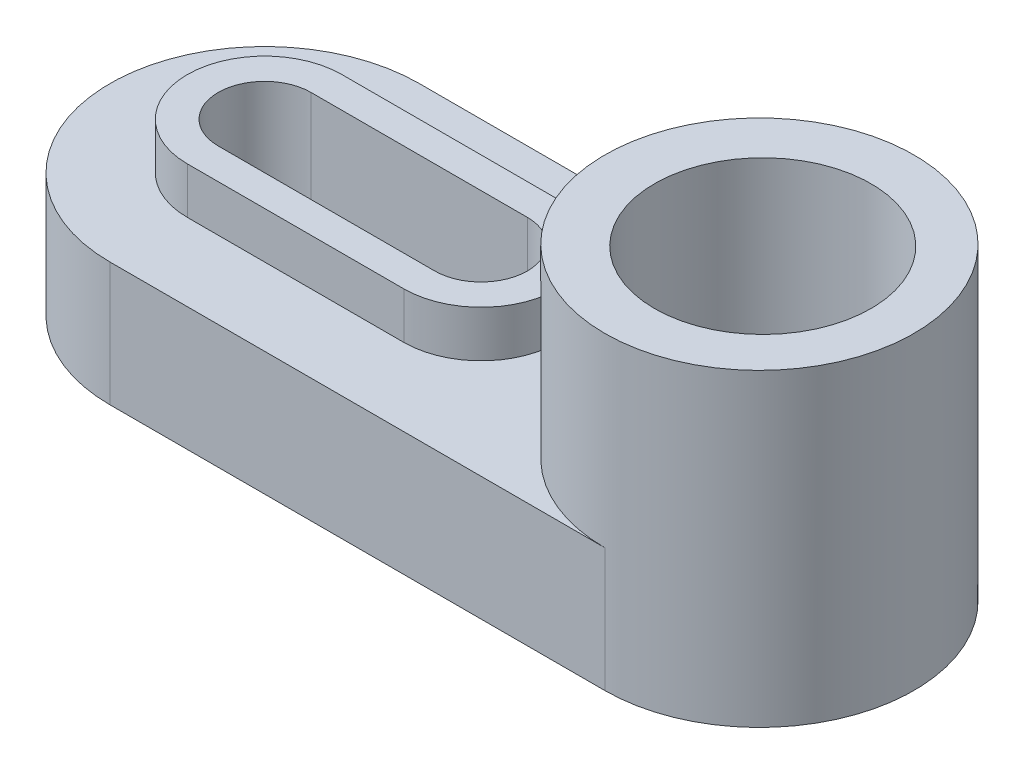
ISO-10303-21;
HEADER;
FILE_DESCRIPTION(('STEP AP214'),'2;1');
FILE_NAME('part.step','',(''),(''),'','','');
FILE_SCHEMA(('AUTOMOTIVE_DESIGN { 1 0 10303 214 1 1 1 1 }'));
ENDSEC;
DATA;
#1=APPLICATION_CONTEXT('core data for automotive mechanical design processes');
#2=APPLICATION_PROTOCOL_DEFINITION('international standard','automotive_design',2000,#1);
#3=PRODUCT_CONTEXT('',#1,'mechanical');
#4=PRODUCT('Part','Part','',(#3));
#5=PRODUCT_RELATED_PRODUCT_CATEGORY('part','',(#4));
#6=PRODUCT_DEFINITION_FORMATION('','',#4);
#7=PRODUCT_DEFINITION_CONTEXT('part definition',#1,'design');
#8=PRODUCT_DEFINITION('design','',#6,#7);
#9=PRODUCT_DEFINITION_SHAPE('','',#8);
#10=(LENGTH_UNIT() NAMED_UNIT(*) SI_UNIT(.MILLI.,.METRE.));
#11=(NAMED_UNIT(*) PLANE_ANGLE_UNIT() SI_UNIT($,.RADIAN.));
#12=(NAMED_UNIT(*) SI_UNIT($,.STERADIAN.) SOLID_ANGLE_UNIT());
#13=UNCERTAINTY_MEASURE_WITH_UNIT(LENGTH_MEASURE(1.E-05),#10,'distance_accuracy_value','');
#14=(GEOMETRIC_REPRESENTATION_CONTEXT(3) GLOBAL_UNCERTAINTY_ASSIGNED_CONTEXT((#13)) GLOBAL_UNIT_ASSIGNED_CONTEXT((#10,
#11,#12)) REPRESENTATION_CONTEXT('',''));
#15=CARTESIAN_POINT('',(0.,0.,0.));
#16=DIRECTION('',(0.,0.,1.));
#17=DIRECTION('',(1.,0.,0.));
#18=AXIS2_PLACEMENT_3D('',#15,#16,#17);
#19=CARTESIAN_POINT('',(0.,8.,0.));
#20=DIRECTION('',(0.,1.,0.));
#21=DIRECTION('',(0.,0.,1.));
#22=AXIS2_PLACEMENT_3D('',#19,#20,#21);
#23=PLANE('',#22);
#24=DIRECTION('',(1.,0.,0.));
#25=VECTOR('',#24,1.);
#26=CARTESIAN_POINT('',(0.,8.,10.));
#27=LINE('',#26,#25);
#28=CARTESIAN_POINT('',(-16.,8.,10.));
#29=VERTEX_POINT('',#28);
#30=CARTESIAN_POINT('',(16.,8.,10.));
#31=VERTEX_POINT('',#30);
#32=EDGE_CURVE('E190',#29,#31,#27,.T.);
#33=ORIENTED_EDGE('',*,*,#32,.T.);
#34=CARTESIAN_POINT('',(16.,8.,0.));
#35=DIRECTION('',(0.,1.,0.));
#36=DIRECTION('',(0.,0.,1.));
#37=AXIS2_PLACEMENT_3D('',#34,#35,#36);
#38=CIRCLE('',#37,10.);
#39=CARTESIAN_POINT('',(16.,8.,-10.));
#40=VERTEX_POINT('',#39);
#41=EDGE_CURVE('E193',#40,#31,#38,.T.);
#42=ORIENTED_EDGE('',*,*,#41,.F.);
#43=DIRECTION('',(1.,0.,0.));
#44=VECTOR('',#43,1.);
#45=CARTESIAN_POINT('',(0.,8.,-10.));
#46=LINE('',#45,#44);
#47=CARTESIAN_POINT('',(-16.,8.,-10.));
#48=VERTEX_POINT('',#47);
#49=EDGE_CURVE('E196',#48,#40,#46,.T.);
#50=ORIENTED_EDGE('',*,*,#49,.F.);
#51=CARTESIAN_POINT('',(-16.,8.,0.));
#52=DIRECTION('',(0.,1.,0.));
#53=DIRECTION('',(0.,0.,1.));
#54=AXIS2_PLACEMENT_3D('',#51,#52,#53);
#55=CIRCLE('',#54,10.);
#56=EDGE_CURVE('E199',#48,#29,#55,.T.);
#57=ORIENTED_EDGE('',*,*,#56,.T.);
#58=EDGE_LOOP('',(#33,#42,#50,#57));
#59=FACE_BOUND('',#58,.T.);
#60=DIRECTION('',(-1.,0.,0.));
#61=VECTOR('',#60,1.);
#62=CARTESIAN_POINT('',(0.,8.,5.));
#63=LINE('',#62,#61);
#64=CARTESIAN_POINT('',(-2.,8.,5.));
#65=VERTEX_POINT('',#64);
#66=CARTESIAN_POINT('',(-16.,8.,5.));
#67=VERTEX_POINT('',#66);
#68=EDGE_CURVE('E53',#65,#67,#63,.T.);
#69=ORIENTED_EDGE('',*,*,#68,.T.);
#70=CARTESIAN_POINT('',(-16.,8.,0.));
#71=DIRECTION('',(0.,1.,0.));
#72=DIRECTION('',(0.,0.,1.));
#73=AXIS2_PLACEMENT_3D('',#70,#71,#72);
#74=CIRCLE('',#73,5.);
#75=CARTESIAN_POINT('',(-16.,8.,-5.));
#76=VERTEX_POINT('',#75);
#77=EDGE_CURVE('E11',#67,#76,#74,.F.);
#78=ORIENTED_EDGE('',*,*,#77,.T.);
#79=DIRECTION('',(1.,0.,0.));
#80=VECTOR('',#79,1.);
#81=CARTESIAN_POINT('',(0.,8.,-5.));
#82=LINE('',#81,#80);
#83=CARTESIAN_POINT('',(-2.,8.,-5.));
#84=VERTEX_POINT('',#83);
#85=EDGE_CURVE('E222',#76,#84,#82,.T.);
#86=ORIENTED_EDGE('',*,*,#85,.T.);
#87=CARTESIAN_POINT('',(-2.,8.,0.));
#88=DIRECTION('',(0.,1.,0.));
#89=DIRECTION('',(0.,0.,1.));
#90=AXIS2_PLACEMENT_3D('',#87,#88,#89);
#91=CIRCLE('',#90,5.);
#92=EDGE_CURVE('E226',#84,#65,#91,.F.);
#93=ORIENTED_EDGE('',*,*,#92,.T.);
#94=EDGE_LOOP('',(#69,#78,#86,#93));
#95=FACE_BOUND('',#94,.T.);
#96=ADVANCED_FACE('F43',(#59,#95),#23,.T.);
#97=CARTESIAN_POINT('',(16.,20.,0.));
#98=DIRECTION('',(0.,-1.,0.));
#99=DIRECTION('',(0.,0.,-1.));
#100=AXIS2_PLACEMENT_3D('',#97,#98,#99);
#101=CYLINDRICAL_SURFACE('',#100,10.);
#102=ORIENTED_EDGE('',*,*,#41,.T.);
#103=DIRECTION('',(0.,-1.,0.));
#104=VECTOR('',#103,1.);
#105=CARTESIAN_POINT('',(16.,8.,9.99999999999999));
#106=LINE('',#105,#104);
#107=CARTESIAN_POINT('',(16.,0.,9.99999999999999));
#108=VERTEX_POINT('',#107);
#109=EDGE_CURVE('E215',#31,#108,#106,.T.);
#110=ORIENTED_EDGE('',*,*,#109,.T.);
#111=CARTESIAN_POINT('',(16.,0.,0.));
#112=DIRECTION('',(0.,1.,0.));
#113=DIRECTION('',(0.,0.,1.));
#114=AXIS2_PLACEMENT_3D('',#111,#112,#113);
#115=CIRCLE('',#114,10.);
#116=CARTESIAN_POINT('',(16.,0.,-10.));
#117=VERTEX_POINT('',#116);
#118=EDGE_CURVE('E218',#108,#117,#115,.T.);
#119=ORIENTED_EDGE('',*,*,#118,.T.);
#120=DIRECTION('',(0.,-1.,0.));
#121=VECTOR('',#120,1.);
#122=CARTESIAN_POINT('',(16.,8.,-10.));
#123=LINE('',#122,#121);
#124=EDGE_CURVE('E212',#40,#117,#123,.T.);
#125=ORIENTED_EDGE('',*,*,#124,.F.);
#126=EDGE_LOOP('',(#102,#110,#119,#125));
#127=FACE_BOUND('',#126,.T.);
#128=CARTESIAN_POINT('',(16.,20.,0.));
#129=DIRECTION('',(0.,1.,0.));
#130=DIRECTION('',(0.,0.,1.));
#131=AXIS2_PLACEMENT_3D('',#128,#129,#130);
#132=CIRCLE('',#131,10.);
#133=CARTESIAN_POINT('',(16.,20.,9.99999999999999));
#134=VERTEX_POINT('',#133);
#135=EDGE_CURVE('E219',#134,#134,#132,.T.);
#136=ORIENTED_EDGE('',*,*,#135,.F.);
#137=EDGE_LOOP('',(#136));
#138=FACE_BOUND('',#137,.T.);
#139=ADVANCED_FACE('F45',(#127,#138),#101,.T.);
#140=CARTESIAN_POINT('',(0.,20.,0.));
#141=DIRECTION('',(0.,1.,0.));
#142=DIRECTION('',(0.,0.,1.));
#143=AXIS2_PLACEMENT_3D('',#140,#141,#142);
#144=PLANE('',#143);
#145=CARTESIAN_POINT('',(16.2184239978713,20.,0.));
#146=DIRECTION('',(0.,1.,0.));
#147=DIRECTION('',(0.,0.,1.));
#148=AXIS2_PLACEMENT_3D('',#145,#146,#147);
#149=CIRCLE('',#148,7.);
#150=CARTESIAN_POINT('',(16.2184239978713,20.,7.));
#151=VERTEX_POINT('',#150);
#152=EDGE_CURVE('E285',#151,#151,#149,.T.);
#153=ORIENTED_EDGE('',*,*,#152,.F.);
#154=EDGE_LOOP('',(#153));
#155=FACE_BOUND('',#154,.T.);
#156=ORIENTED_EDGE('',*,*,#135,.T.);
#157=EDGE_LOOP('',(#156));
#158=FACE_BOUND('',#157,.T.);
#159=ADVANCED_FACE('F256',(#155,#158),#144,.T.);
#160=CARTESIAN_POINT('',(0.,0.,0.));
#161=DIRECTION('',(0.,1.,0.));
#162=DIRECTION('',(0.,0.,1.));
#163=AXIS2_PLACEMENT_3D('',#160,#161,#162);
#164=PLANE('',#163);
#165=CARTESIAN_POINT('',(16.2184239978713,0.,0.));
#166=DIRECTION('',(0.,1.,0.));
#167=DIRECTION('',(0.,0.,1.));
#168=AXIS2_PLACEMENT_3D('',#165,#166,#167);
#169=CIRCLE('',#168,7.);
#170=CARTESIAN_POINT('',(16.2184239978713,0.,7.));
#171=VERTEX_POINT('',#170);
#172=EDGE_CURVE('E159',#171,#171,#169,.T.);
#173=ORIENTED_EDGE('',*,*,#172,.T.);
#174=EDGE_LOOP('',(#173));
#175=FACE_BOUND('',#174,.T.);
#176=DIRECTION('',(1.,0.,0.));
#177=VECTOR('',#176,1.);
#178=CARTESIAN_POINT('',(0.,0.,3.));
#179=LINE('',#178,#177);
#180=CARTESIAN_POINT('',(-16.,0.,3.));
#181=VERTEX_POINT('',#180);
#182=CARTESIAN_POINT('',(-2.,0.,3.));
#183=VERTEX_POINT('',#182);
#184=EDGE_CURVE('E47',#181,#183,#179,.T.);
#185=ORIENTED_EDGE('',*,*,#184,.T.);
#186=CARTESIAN_POINT('',(-2.,0.,0.));
#187=DIRECTION('',(0.,-1.,0.));
#188=DIRECTION('',(0.,0.,-1.));
#189=AXIS2_PLACEMENT_3D('',#186,#187,#188);
#190=CIRCLE('',#189,3.);
#191=CARTESIAN_POINT('',(-2.,0.,-3.));
#192=VERTEX_POINT('',#191);
#193=EDGE_CURVE('E146',#183,#192,#190,.F.);
#194=ORIENTED_EDGE('',*,*,#193,.T.);
#195=DIRECTION('',(-1.,0.,0.));
#196=VECTOR('',#195,1.);
#197=CARTESIAN_POINT('',(0.,0.,-3.));
#198=LINE('',#197,#196);
#199=CARTESIAN_POINT('',(-16.,0.,-3.));
#200=VERTEX_POINT('',#199);
#201=EDGE_CURVE('E151',#200,#192,#198,.F.);
#202=ORIENTED_EDGE('',*,*,#201,.F.);
#203=CARTESIAN_POINT('',(-16.,0.,0.));
#204=DIRECTION('',(0.,-1.,0.));
#205=DIRECTION('',(0.,0.,-1.));
#206=AXIS2_PLACEMENT_3D('',#203,#204,#205);
#207=CIRCLE('',#206,3.);
#208=EDGE_CURVE('E154',#200,#181,#207,.F.);
#209=ORIENTED_EDGE('',*,*,#208,.T.);
#210=EDGE_LOOP('',(#185,#194,#202,#209));
#211=FACE_BOUND('',#210,.T.);
#212=ORIENTED_EDGE('',*,*,#118,.F.);
#213=DIRECTION('',(1.,0.,0.));
#214=VECTOR('',#213,1.);
#215=CARTESIAN_POINT('',(0.,0.,10.));
#216=LINE('',#215,#214);
#217=CARTESIAN_POINT('',(-16.,0.,10.));
#218=VERTEX_POINT('',#217);
#219=EDGE_CURVE('E189',#218,#108,#216,.T.);
#220=ORIENTED_EDGE('',*,*,#219,.F.);
#221=CARTESIAN_POINT('',(-16.,0.,0.));
#222=DIRECTION('',(0.,1.,0.));
#223=DIRECTION('',(0.,0.,1.));
#224=AXIS2_PLACEMENT_3D('',#221,#222,#223);
#225=CIRCLE('',#224,10.);
#226=CARTESIAN_POINT('',(-16.,0.,-10.));
#227=VERTEX_POINT('',#226);
#228=EDGE_CURVE('E194',#227,#218,#225,.T.);
#229=ORIENTED_EDGE('',*,*,#228,.F.);
#230=DIRECTION('',(1.,0.,0.));
#231=VECTOR('',#230,1.);
#232=CARTESIAN_POINT('',(0.,0.,-10.));
#233=LINE('',#232,#231);
#234=EDGE_CURVE('E204',#227,#117,#233,.T.);
#235=ORIENTED_EDGE('',*,*,#234,.T.);
#236=EDGE_LOOP('',(#212,#220,#229,#235));
#237=FACE_BOUND('',#236,.T.);
#238=ADVANCED_FACE('F152',(#175,#211,#237),#164,.F.);
#239=CARTESIAN_POINT('',(0.,8.,10.));
#240=DIRECTION('',(0.,0.,-1.));
#241=DIRECTION('',(-1.,0.,0.));
#242=AXIS2_PLACEMENT_3D('',#239,#240,#241);
#243=PLANE('',#242);
#244=ORIENTED_EDGE('',*,*,#219,.T.);
#245=ORIENTED_EDGE('',*,*,#109,.F.);
#246=ORIENTED_EDGE('',*,*,#32,.F.);
#247=DIRECTION('',(0.,-1.,0.));
#248=VECTOR('',#247,1.);
#249=CARTESIAN_POINT('',(-16.,8.,10.));
#250=LINE('',#249,#248);
#251=EDGE_CURVE('E201',#29,#218,#250,.T.);
#252=ORIENTED_EDGE('',*,*,#251,.T.);
#253=EDGE_LOOP('',(#244,#245,#246,#252));
#254=FACE_BOUND('',#253,.T.);
#255=ADVANCED_FACE('F270',(#254),#243,.F.);
#256=CARTESIAN_POINT('',(0.,8.,-10.));
#257=DIRECTION('',(0.,0.,-1.));
#258=DIRECTION('',(-1.,0.,0.));
#259=AXIS2_PLACEMENT_3D('',#256,#257,#258);
#260=PLANE('',#259);
#261=ORIENTED_EDGE('',*,*,#234,.F.);
#262=DIRECTION('',(0.,-1.,0.));
#263=VECTOR('',#262,1.);
#264=CARTESIAN_POINT('',(-16.,8.,-10.));
#265=LINE('',#264,#263);
#266=EDGE_CURVE('E210',#48,#227,#265,.T.);
#267=ORIENTED_EDGE('',*,*,#266,.F.);
#268=ORIENTED_EDGE('',*,*,#49,.T.);
#269=ORIENTED_EDGE('',*,*,#124,.T.);
#270=EDGE_LOOP('',(#261,#267,#268,#269));
#271=FACE_BOUND('',#270,.T.);
#272=ADVANCED_FACE('F266',(#271),#260,.T.);
#273=CARTESIAN_POINT('',(-16.,8.,0.));
#274=DIRECTION('',(0.,-1.,0.));
#275=DIRECTION('',(0.,0.,-1.));
#276=AXIS2_PLACEMENT_3D('',#273,#274,#275);
#277=CYLINDRICAL_SURFACE('',#276,10.);
#278=ORIENTED_EDGE('',*,*,#228,.T.);
#279=ORIENTED_EDGE('',*,*,#251,.F.);
#280=ORIENTED_EDGE('',*,*,#56,.F.);
#281=ORIENTED_EDGE('',*,*,#266,.T.);
#282=EDGE_LOOP('',(#278,#279,#280,#281));
#283=FACE_BOUND('',#282,.T.);
#284=ADVANCED_FACE('F263',(#283),#277,.T.);
#285=CARTESIAN_POINT('',(-16.,11.,0.));
#286=DIRECTION('',(0.,1.,0.));
#287=DIRECTION('',(0.,0.,1.));
#288=AXIS2_PLACEMENT_3D('',#285,#286,#287);
#289=PLANE('',#288);
#290=CARTESIAN_POINT('',(-16.,11.,0.));
#291=DIRECTION('',(0.,1.,0.));
#292=DIRECTION('',(0.,0.,1.));
#293=AXIS2_PLACEMENT_3D('',#290,#291,#292);
#294=CIRCLE('',#293,5.);
#295=CARTESIAN_POINT('',(-16.,11.,-5.));
#296=VERTEX_POINT('',#295);
#297=CARTESIAN_POINT('',(-16.,11.,5.));
#298=VERTEX_POINT('',#297);
#299=EDGE_CURVE('E169',#296,#298,#294,.T.);
#300=ORIENTED_EDGE('',*,*,#299,.T.);
#301=DIRECTION('',(1.,0.,0.));
#302=VECTOR('',#301,1.);
#303=CARTESIAN_POINT('',(-16.,11.,5.));
#304=LINE('',#303,#302);
#305=CARTESIAN_POINT('',(-2.,11.,5.));
#306=VERTEX_POINT('',#305);
#307=EDGE_CURVE('E172',#298,#306,#304,.T.);
#308=ORIENTED_EDGE('',*,*,#307,.T.);
#309=CARTESIAN_POINT('',(-2.,11.,0.));
#310=DIRECTION('',(0.,1.,0.));
#311=DIRECTION('',(0.,0.,1.));
#312=AXIS2_PLACEMENT_3D('',#309,#310,#311);
#313=CIRCLE('',#312,5.);
#314=CARTESIAN_POINT('',(-2.,11.,-5.));
#315=VERTEX_POINT('',#314);
#316=EDGE_CURVE('E174',#306,#315,#313,.T.);
#317=ORIENTED_EDGE('',*,*,#316,.T.);
#318=DIRECTION('',(-1.,0.,0.));
#319=VECTOR('',#318,1.);
#320=CARTESIAN_POINT('',(-16.,11.,-5.));
#321=LINE('',#320,#319);
#322=EDGE_CURVE('E176',#315,#296,#321,.T.);
#323=ORIENTED_EDGE('',*,*,#322,.T.);
#324=EDGE_LOOP('',(#300,#308,#317,#323));
#325=FACE_BOUND('',#324,.T.);
#326=DIRECTION('',(1.,0.,0.));
#327=VECTOR('',#326,1.);
#328=CARTESIAN_POINT('',(-16.,11.,3.));
#329=LINE('',#328,#327);
#330=CARTESIAN_POINT('',(-16.,11.,3.));
#331=VERTEX_POINT('',#330);
#332=CARTESIAN_POINT('',(-2.,11.,3.));
#333=VERTEX_POINT('',#332);
#334=EDGE_CURVE('E139',#331,#333,#329,.T.);
#335=ORIENTED_EDGE('',*,*,#334,.F.);
#336=CARTESIAN_POINT('',(-16.,11.,0.));
#337=DIRECTION('',(0.,1.,0.));
#338=DIRECTION('',(0.,0.,1.));
#339=AXIS2_PLACEMENT_3D('',#336,#337,#338);
#340=CIRCLE('',#339,3.);
#341=CARTESIAN_POINT('',(-16.,11.,-3.));
#342=VERTEX_POINT('',#341);
#343=EDGE_CURVE('E129',#342,#331,#340,.T.);
#344=ORIENTED_EDGE('',*,*,#343,.F.);
#345=DIRECTION('',(-1.,0.,0.));
#346=VECTOR('',#345,1.);
#347=CARTESIAN_POINT('',(-16.,11.,-3.));
#348=LINE('',#347,#346);
#349=CARTESIAN_POINT('',(-2.,11.,-3.));
#350=VERTEX_POINT('',#349);
#351=EDGE_CURVE('E163',#350,#342,#348,.T.);
#352=ORIENTED_EDGE('',*,*,#351,.F.);
#353=CARTESIAN_POINT('',(-2.,11.,0.));
#354=DIRECTION('',(0.,1.,0.));
#355=DIRECTION('',(0.,0.,1.));
#356=AXIS2_PLACEMENT_3D('',#353,#354,#355);
#357=CIRCLE('',#356,3.);
#358=EDGE_CURVE('E156',#333,#350,#357,.T.);
#359=ORIENTED_EDGE('',*,*,#358,.F.);
#360=EDGE_LOOP('',(#335,#344,#352,#359));
#361=FACE_BOUND('',#360,.T.);
#362=ADVANCED_FACE('F265',(#325,#361),#289,.T.);
#363=CARTESIAN_POINT('',(-16.,11.,0.));
#364=DIRECTION('',(0.,-1.,0.));
#365=DIRECTION('',(0.,0.,-1.));
#366=AXIS2_PLACEMENT_3D('',#363,#364,#365);
#367=CYLINDRICAL_SURFACE('',#366,5.);
#368=ORIENTED_EDGE('',*,*,#77,.F.);
#369=DIRECTION('',(0.,-1.,0.));
#370=VECTOR('',#369,1.);
#371=CARTESIAN_POINT('',(-16.,11.,5.));
#372=LINE('',#371,#370);
#373=EDGE_CURVE('E186',#298,#67,#372,.T.);
#374=ORIENTED_EDGE('',*,*,#373,.F.);
#375=ORIENTED_EDGE('',*,*,#299,.F.);
#376=DIRECTION('',(0.,-1.,0.));
#377=VECTOR('',#376,1.);
#378=CARTESIAN_POINT('',(-16.,11.,-5.));
#379=LINE('',#378,#377);
#380=EDGE_CURVE('E178',#296,#76,#379,.T.);
#381=ORIENTED_EDGE('',*,*,#380,.T.);
#382=EDGE_LOOP('',(#368,#374,#375,#381));
#383=FACE_BOUND('',#382,.T.);
#384=ADVANCED_FACE('F261',(#383),#367,.T.);
#385=CARTESIAN_POINT('',(-16.,11.,5.));
#386=DIRECTION('',(0.,0.,-1.));
#387=DIRECTION('',(-1.,0.,0.));
#388=AXIS2_PLACEMENT_3D('',#385,#386,#387);
#389=PLANE('',#388);
#390=ORIENTED_EDGE('',*,*,#68,.F.);
#391=DIRECTION('',(0.,-1.,0.));
#392=VECTOR('',#391,1.);
#393=CARTESIAN_POINT('',(-2.,11.,5.));
#394=LINE('',#393,#392);
#395=EDGE_CURVE('E183',#306,#65,#394,.T.);
#396=ORIENTED_EDGE('',*,*,#395,.F.);
#397=ORIENTED_EDGE('',*,*,#307,.F.);
#398=ORIENTED_EDGE('',*,*,#373,.T.);
#399=EDGE_LOOP('',(#390,#396,#397,#398));
#400=FACE_BOUND('',#399,.T.);
#401=ADVANCED_FACE('F365',(#400),#389,.F.);
#402=CARTESIAN_POINT('',(-2.,11.,0.));
#403=DIRECTION('',(0.,-1.,0.));
#404=DIRECTION('',(0.,0.,-1.));
#405=AXIS2_PLACEMENT_3D('',#402,#403,#404);
#406=CYLINDRICAL_SURFACE('',#405,5.);
#407=ORIENTED_EDGE('',*,*,#92,.F.);
#408=DIRECTION('',(0.,-1.,0.));
#409=VECTOR('',#408,1.);
#410=CARTESIAN_POINT('',(-2.,11.,-5.));
#411=LINE('',#410,#409);
#412=EDGE_CURVE('E181',#315,#84,#411,.T.);
#413=ORIENTED_EDGE('',*,*,#412,.F.);
#414=ORIENTED_EDGE('',*,*,#316,.F.);
#415=ORIENTED_EDGE('',*,*,#395,.T.);
#416=EDGE_LOOP('',(#407,#413,#414,#415));
#417=FACE_BOUND('',#416,.T.);
#418=ADVANCED_FACE('F244',(#417),#406,.T.);
#419=CARTESIAN_POINT('',(-16.,11.,-5.));
#420=DIRECTION('',(0.,0.,1.));
#421=DIRECTION('',(1.,0.,0.));
#422=AXIS2_PLACEMENT_3D('',#419,#420,#421);
#423=PLANE('',#422);
#424=ORIENTED_EDGE('',*,*,#85,.F.);
#425=ORIENTED_EDGE('',*,*,#380,.F.);
#426=ORIENTED_EDGE('',*,*,#322,.F.);
#427=ORIENTED_EDGE('',*,*,#412,.T.);
#428=EDGE_LOOP('',(#424,#425,#426,#427));
#429=FACE_BOUND('',#428,.T.);
#430=ADVANCED_FACE('F237',(#429),#423,.F.);
#431=CARTESIAN_POINT('',(-16.,11.,0.));
#432=DIRECTION('',(0.,-1.,0.));
#433=DIRECTION('',(0.,0.,-1.));
#434=AXIS2_PLACEMENT_3D('',#431,#432,#433);
#435=CYLINDRICAL_SURFACE('',#434,3.);
#436=DIRECTION('',(0.,-1.,0.));
#437=VECTOR('',#436,1.);
#438=CARTESIAN_POINT('',(-16.,11.,3.));
#439=LINE('',#438,#437);
#440=EDGE_CURVE('E61',#331,#181,#439,.T.);
#441=ORIENTED_EDGE('',*,*,#440,.T.);
#442=ORIENTED_EDGE('',*,*,#208,.F.);
#443=DIRECTION('',(0.,-1.,0.));
#444=VECTOR('',#443,1.);
#445=CARTESIAN_POINT('',(-16.,11.,-3.));
#446=LINE('',#445,#444);
#447=EDGE_CURVE('E165',#342,#200,#446,.T.);
#448=ORIENTED_EDGE('',*,*,#447,.F.);
#449=ORIENTED_EDGE('',*,*,#343,.T.);
#450=EDGE_LOOP('',(#441,#442,#448,#449));
#451=FACE_BOUND('',#450,.T.);
#452=ADVANCED_FACE('F235',(#451),#435,.F.);
#453=CARTESIAN_POINT('',(-16.,11.,3.));
#454=DIRECTION('',(0.,0.,-1.));
#455=DIRECTION('',(-1.,0.,0.));
#456=AXIS2_PLACEMENT_3D('',#453,#454,#455);
#457=PLANE('',#456);
#458=DIRECTION('',(0.,-1.,0.));
#459=VECTOR('',#458,1.);
#460=CARTESIAN_POINT('',(-2.,11.,3.));
#461=LINE('',#460,#459);
#462=EDGE_CURVE('E133',#333,#183,#461,.T.);
#463=ORIENTED_EDGE('',*,*,#462,.T.);
#464=ORIENTED_EDGE('',*,*,#184,.F.);
#465=ORIENTED_EDGE('',*,*,#440,.F.);
#466=ORIENTED_EDGE('',*,*,#334,.T.);
#467=EDGE_LOOP('',(#463,#464,#465,#466));
#468=FACE_BOUND('',#467,.T.);
#469=ADVANCED_FACE('F135',(#468),#457,.T.);
#470=CARTESIAN_POINT('',(-2.,11.,0.));
#471=DIRECTION('',(0.,-1.,0.));
#472=DIRECTION('',(0.,0.,-1.));
#473=AXIS2_PLACEMENT_3D('',#470,#471,#472);
#474=CYLINDRICAL_SURFACE('',#473,3.);
#475=DIRECTION('',(0.,-1.,0.));
#476=VECTOR('',#475,1.);
#477=CARTESIAN_POINT('',(-2.,11.,-3.));
#478=LINE('',#477,#476);
#479=EDGE_CURVE('E143',#350,#192,#478,.T.);
#480=ORIENTED_EDGE('',*,*,#479,.T.);
#481=ORIENTED_EDGE('',*,*,#193,.F.);
#482=ORIENTED_EDGE('',*,*,#462,.F.);
#483=ORIENTED_EDGE('',*,*,#358,.T.);
#484=EDGE_LOOP('',(#480,#481,#482,#483));
#485=FACE_BOUND('',#484,.T.);
#486=ADVANCED_FACE('F147',(#485),#474,.F.);
#487=CARTESIAN_POINT('',(-16.,11.,-3.));
#488=DIRECTION('',(0.,0.,1.));
#489=DIRECTION('',(1.,0.,0.));
#490=AXIS2_PLACEMENT_3D('',#487,#488,#489);
#491=PLANE('',#490);
#492=ORIENTED_EDGE('',*,*,#447,.T.);
#493=ORIENTED_EDGE('',*,*,#201,.T.);
#494=ORIENTED_EDGE('',*,*,#479,.F.);
#495=ORIENTED_EDGE('',*,*,#351,.T.);
#496=EDGE_LOOP('',(#492,#493,#494,#495));
#497=FACE_BOUND('',#496,.T.);
#498=ADVANCED_FACE('F233',(#497),#491,.T.);
#499=CARTESIAN_POINT('',(16.2184239978713,20.,0.));
#500=DIRECTION('',(0.,1.,0.));
#501=DIRECTION('',(0.,0.,1.));
#502=AXIS2_PLACEMENT_3D('',#499,#500,#501);
#503=CYLINDRICAL_SURFACE('',#502,7.);
#504=ORIENTED_EDGE('',*,*,#172,.F.);
#505=EDGE_LOOP('',(#504));
#506=FACE_BOUND('',#505,.T.);
#507=ORIENTED_EDGE('',*,*,#152,.T.);
#508=EDGE_LOOP('',(#507));
#509=FACE_BOUND('',#508,.T.);
#510=ADVANCED_FACE('F289',(#506,#509),#503,.F.);
#511=CLOSED_SHELL('',(#96,#139,#159,#238,#255,#272,#284,#362,#384,#401,#418,#430,#452,#469,#486,
#498,#510));
#512=MANIFOLD_SOLID_BREP('B2',#511);
#513=ADVANCED_BREP_SHAPE_REPRESENTATION('',(#18,#512),#14);
#514=SHAPE_DEFINITION_REPRESENTATION(#9,#513);
ENDSEC;
END-ISO-10303-21;
